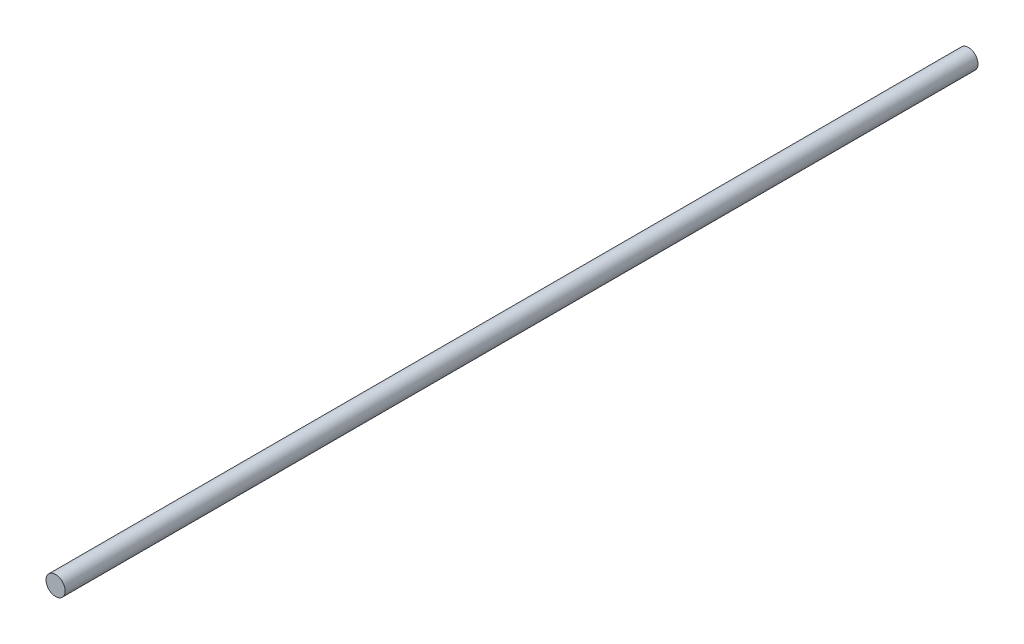
ISO-10303-21;
HEADER;
FILE_DESCRIPTION(('STEP AP214'),'2;1');
FILE_NAME('part.step','',(''),(''),'','','');
FILE_SCHEMA(('AUTOMOTIVE_DESIGN { 1 0 10303 214 1 1 1 1 }'));
ENDSEC;
DATA;
#1=APPLICATION_CONTEXT('core data for automotive mechanical design processes');
#2=APPLICATION_PROTOCOL_DEFINITION('international standard','automotive_design',2000,#1);
#3=PRODUCT_CONTEXT('',#1,'mechanical');
#4=PRODUCT('Part','Part','',(#3));
#5=PRODUCT_RELATED_PRODUCT_CATEGORY('part','',(#4));
#6=PRODUCT_DEFINITION_FORMATION('','',#4);
#7=PRODUCT_DEFINITION_CONTEXT('part definition',#1,'design');
#8=PRODUCT_DEFINITION('design','',#6,#7);
#9=PRODUCT_DEFINITION_SHAPE('','',#8);
#10=(LENGTH_UNIT() NAMED_UNIT(*) SI_UNIT(.MILLI.,.METRE.));
#11=(NAMED_UNIT(*) PLANE_ANGLE_UNIT() SI_UNIT($,.RADIAN.));
#12=(NAMED_UNIT(*) SI_UNIT($,.STERADIAN.) SOLID_ANGLE_UNIT());
#13=UNCERTAINTY_MEASURE_WITH_UNIT(LENGTH_MEASURE(1.E-05),#10,'distance_accuracy_value','');
#14=(GEOMETRIC_REPRESENTATION_CONTEXT(3) GLOBAL_UNCERTAINTY_ASSIGNED_CONTEXT((#13)) GLOBAL_UNIT_ASSIGNED_CONTEXT((#10,
#11,#12)) REPRESENTATION_CONTEXT('',''));
#15=CARTESIAN_POINT('',(0.,0.,0.));
#16=DIRECTION('',(0.,0.,1.));
#17=DIRECTION('',(1.,0.,0.));
#18=AXIS2_PLACEMENT_3D('',#15,#16,#17);
#19=CARTESIAN_POINT('',(0.,0.,381.12));
#20=DIRECTION('',(0.,0.,-1.));
#21=DIRECTION('',(-1.,0.,0.));
#22=AXIS2_PLACEMENT_3D('',#19,#20,#21);
#23=CYLINDRICAL_SURFACE('',#22,4.);
#24=CARTESIAN_POINT('',(0.,0.,381.12));
#25=DIRECTION('',(0.,0.,1.));
#26=DIRECTION('',(1.,0.,0.));
#27=AXIS2_PLACEMENT_3D('',#24,#25,#26);
#28=CIRCLE('',#27,4.);
#29=CARTESIAN_POINT('',(4.,0.,381.12));
#30=VERTEX_POINT('',#29);
#31=EDGE_CURVE('E10',#30,#30,#28,.T.);
#32=ORIENTED_EDGE('',*,*,#31,.F.);
#33=EDGE_LOOP('',(#32));
#34=FACE_BOUND('',#33,.T.);
#35=CARTESIAN_POINT('',(0.,0.,0.));
#36=DIRECTION('',(0.,0.,1.));
#37=DIRECTION('',(1.,0.,0.));
#38=AXIS2_PLACEMENT_3D('',#35,#36,#37);
#39=CIRCLE('',#38,4.);
#40=CARTESIAN_POINT('',(4.,0.,0.));
#41=VERTEX_POINT('',#40);
#42=EDGE_CURVE('E34',#41,#41,#39,.T.);
#43=ORIENTED_EDGE('',*,*,#42,.T.);
#44=EDGE_LOOP('',(#43));
#45=FACE_BOUND('',#44,.T.);
#46=ADVANCED_FACE('F31',(#34,#45),#23,.T.);
#47=CARTESIAN_POINT('',(0.,0.,381.12));
#48=DIRECTION('',(0.,0.,1.));
#49=DIRECTION('',(1.,0.,0.));
#50=AXIS2_PLACEMENT_3D('',#47,#48,#49);
#51=PLANE('',#50);
#52=ORIENTED_EDGE('',*,*,#31,.T.);
#53=EDGE_LOOP('',(#52));
#54=FACE_BOUND('',#53,.T.);
#55=ADVANCED_FACE('F46',(#54),#51,.T.);
#56=CARTESIAN_POINT('',(0.,0.,0.));
#57=DIRECTION('',(0.,0.,1.));
#58=DIRECTION('',(1.,0.,0.));
#59=AXIS2_PLACEMENT_3D('',#56,#57,#58);
#60=PLANE('',#59);
#61=ORIENTED_EDGE('',*,*,#42,.F.);
#62=EDGE_LOOP('',(#61));
#63=FACE_BOUND('',#62,.T.);
#64=ADVANCED_FACE('F44',(#63),#60,.F.);
#65=CLOSED_SHELL('',(#46,#55,#64));
#66=MANIFOLD_SOLID_BREP('B2',#65);
#67=ADVANCED_BREP_SHAPE_REPRESENTATION('',(#18,#66),#14);
#68=SHAPE_DEFINITION_REPRESENTATION(#9,#67);
ENDSEC;
END-ISO-10303-21;
